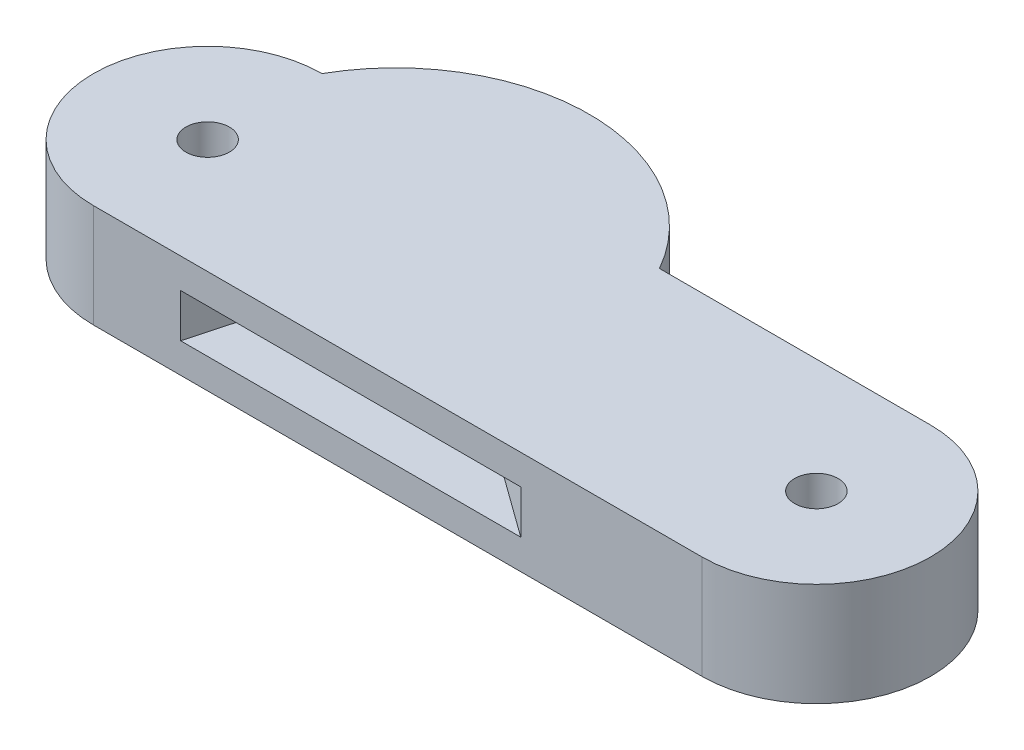
ISO-10303-21;
HEADER;
FILE_DESCRIPTION(('STEP AP214'),'2;1');
FILE_NAME('part.step','',(''),(''),'','','');
FILE_SCHEMA(('AUTOMOTIVE_DESIGN { 1 0 10303 214 1 1 1 1 }'));
ENDSEC;
DATA;
#1=APPLICATION_CONTEXT('core data for automotive mechanical design processes');
#2=APPLICATION_PROTOCOL_DEFINITION('international standard','automotive_design',2000,#1);
#3=PRODUCT_CONTEXT('',#1,'mechanical');
#4=PRODUCT('Part','Part','',(#3));
#5=PRODUCT_RELATED_PRODUCT_CATEGORY('part','',(#4));
#6=PRODUCT_DEFINITION_FORMATION('','',#4);
#7=PRODUCT_DEFINITION_CONTEXT('part definition',#1,'design');
#8=PRODUCT_DEFINITION('design','',#6,#7);
#9=PRODUCT_DEFINITION_SHAPE('','',#8);
#10=(LENGTH_UNIT() NAMED_UNIT(*) SI_UNIT(.MILLI.,.METRE.));
#11=(NAMED_UNIT(*) PLANE_ANGLE_UNIT() SI_UNIT($,.RADIAN.));
#12=(NAMED_UNIT(*) SI_UNIT($,.STERADIAN.) SOLID_ANGLE_UNIT());
#13=UNCERTAINTY_MEASURE_WITH_UNIT(LENGTH_MEASURE(1.E-05),#10,'distance_accuracy_value','');
#14=(GEOMETRIC_REPRESENTATION_CONTEXT(3) GLOBAL_UNCERTAINTY_ASSIGNED_CONTEXT((#13)) GLOBAL_UNIT_ASSIGNED_CONTEXT((#10,
#11,#12)) REPRESENTATION_CONTEXT('',''));
#15=CARTESIAN_POINT('',(0.,0.,0.));
#16=DIRECTION('',(0.,0.,1.));
#17=DIRECTION('',(1.,0.,0.));
#18=AXIS2_PLACEMENT_3D('',#15,#16,#17);
#19=CARTESIAN_POINT('',(0.,-4.75,0.));
#20=DIRECTION('',(0.,1.,0.));
#21=DIRECTION('',(0.,0.,-1.));
#22=AXIS2_PLACEMENT_3D('',#19,#20,#21);
#23=CYLINDRICAL_SURFACE('',#22,2.);
#24=CARTESIAN_POINT('',(0.,4.75,0.));
#25=DIRECTION('',(0.,1.,0.));
#26=DIRECTION('',(0.,0.,1.));
#27=AXIS2_PLACEMENT_3D('',#24,#25,#26);
#28=CIRCLE('',#27,2.);
#29=CARTESIAN_POINT('',(0.,4.75,2.));
#30=VERTEX_POINT('',#29);
#31=EDGE_CURVE('E219',#30,#30,#28,.T.);
#32=ORIENTED_EDGE('',*,*,#31,.T.);
#33=EDGE_LOOP('',(#32));
#34=FACE_BOUND('',#33,.T.);
#35=CARTESIAN_POINT('',(0.,-2.75,0.));
#36=DIRECTION('',(0.,1.,0.));
#37=DIRECTION('',(0.,0.,1.));
#38=AXIS2_PLACEMENT_3D('',#35,#36,#37);
#39=CIRCLE('',#38,2.);
#40=CARTESIAN_POINT('',(0.,-2.75,2.));
#41=VERTEX_POINT('',#40);
#42=EDGE_CURVE('E59',#41,#41,#39,.T.);
#43=ORIENTED_EDGE('',*,*,#42,.F.);
#44=EDGE_LOOP('',(#43));
#45=FACE_BOUND('',#44,.T.);
#46=ADVANCED_FACE('F55',(#34,#45),#23,.F.);
#47=CARTESIAN_POINT('',(-40.4241193156667,-37.0570550282,-1.7460511013579));
#48=DIRECTION('',(0.,1.,0.));
#49=DIRECTION('',(0.,0.,-1.));
#50=AXIS2_PLACEMENT_3D('',#47,#48,#49);
#51=CYLINDRICAL_SURFACE('',#50,17.8069548217708);
#52=CARTESIAN_POINT('',(-40.4241193156667,-4.75,-1.7460511013579));
#53=DIRECTION('',(0.,1.,0.));
#54=DIRECTION('',(0.,0.,1.));
#55=AXIS2_PLACEMENT_3D('',#52,#53,#54);
#56=CIRCLE('',#55,17.8069548217708);
#57=CARTESIAN_POINT('',(-24.917700351162,-4.75,-10.5003992165423));
#58=VERTEX_POINT('',#57);
#59=CARTESIAN_POINT('',(-55.9305382801715,-4.75,-10.5003992165423));
#60=VERTEX_POINT('',#59);
#61=EDGE_CURVE('E185',#58,#60,#56,.T.);
#62=ORIENTED_EDGE('',*,*,#61,.T.);
#63=DIRECTION('',(0.,1.,0.));
#64=VECTOR('',#63,1.);
#65=CARTESIAN_POINT('',(-55.9305382801715,-4.75,-10.5003992165423));
#66=LINE('',#65,#64);
#67=CARTESIAN_POINT('',(-55.9305382801715,4.75,-10.5003992165423));
#68=VERTEX_POINT('',#67);
#69=EDGE_CURVE('E260',#60,#68,#66,.T.);
#70=ORIENTED_EDGE('',*,*,#69,.T.);
#71=CARTESIAN_POINT('',(-40.4241193156667,4.75,-1.7460511013579));
#72=DIRECTION('',(0.,1.,0.));
#73=DIRECTION('',(0.,0.,1.));
#74=AXIS2_PLACEMENT_3D('',#71,#72,#73);
#75=CIRCLE('',#74,17.8069548217708);
#76=CARTESIAN_POINT('',(-24.917700351162,4.75,-10.5003992165423));
#77=VERTEX_POINT('',#76);
#78=EDGE_CURVE('E179',#68,#77,#75,.F.);
#79=ORIENTED_EDGE('',*,*,#78,.T.);
#80=DIRECTION('',(0.,1.,0.));
#81=VECTOR('',#80,1.);
#82=CARTESIAN_POINT('',(-24.917700351162,-37.0570550282,-10.5003992165423));
#83=LINE('',#82,#81);
#84=EDGE_CURVE('E184',#58,#77,#83,.T.);
#85=ORIENTED_EDGE('',*,*,#84,.F.);
#86=EDGE_LOOP('',(#62,#70,#79,#85));
#87=FACE_BOUND('',#86,.T.);
#88=CARTESIAN_POINT('',(-40.4241193156667,2.,-1.7460511013579));
#89=DIRECTION('',(0.,1.,0.));
#90=DIRECTION('',(0.,0.,1.));
#91=AXIS2_PLACEMENT_3D('',#88,#89,#90);
#92=CIRCLE('',#91,17.8069548217708);
#93=CARTESIAN_POINT('',(-35.7381547906292,2.,-18.9253810211969));
#94=VERTEX_POINT('',#93);
#95=CARTESIAN_POINT('',(-54.8543825263999,2.,-12.1794179449777));
#96=VERTEX_POINT('',#95);
#97=EDGE_CURVE('E161',#94,#96,#92,.T.);
#98=ORIENTED_EDGE('',*,*,#97,.T.);
#99=DIRECTION('',(0.,-1.,0.));
#100=VECTOR('',#99,1.);
#101=CARTESIAN_POINT('',(-54.8543825263999,2.,-12.1794179449777));
#102=LINE('',#101,#100);
#103=CARTESIAN_POINT('',(-54.8543825263999,-2.,-12.1794179449777));
#104=VERTEX_POINT('',#103);
#105=EDGE_CURVE('E164',#96,#104,#102,.T.);
#106=ORIENTED_EDGE('',*,*,#105,.T.);
#107=CARTESIAN_POINT('',(-40.4241193156667,-2.,-1.7460511013579));
#108=DIRECTION('',(0.,1.,0.));
#109=DIRECTION('',(0.,0.,1.));
#110=AXIS2_PLACEMENT_3D('',#107,#108,#109);
#111=CIRCLE('',#110,17.8069548217708);
#112=CARTESIAN_POINT('',(-35.7381547906292,-2.,-18.9253810211969));
#113=VERTEX_POINT('',#112);
#114=EDGE_CURVE('E162',#113,#104,#111,.T.);
#115=ORIENTED_EDGE('',*,*,#114,.F.);
#116=DIRECTION('',(0.,-1.,0.));
#117=VECTOR('',#116,1.);
#118=CARTESIAN_POINT('',(-35.7381547906292,2.,-18.9253810211969));
#119=LINE('',#118,#117);
#120=EDGE_CURVE('E148',#94,#113,#119,.T.);
#121=ORIENTED_EDGE('',*,*,#120,.F.);
#122=EDGE_LOOP('',(#98,#106,#115,#121));
#123=FACE_BOUND('',#122,.T.);
#124=ADVANCED_FACE('F159',(#87,#123),#51,.T.);
#125=CARTESIAN_POINT('',(0.,-4.75,-10.5003992165423));
#126=DIRECTION('',(0.,0.,1.));
#127=DIRECTION('',(1.,0.,0.));
#128=AXIS2_PLACEMENT_3D('',#125,#126,#127);
#129=PLANE('',#128);
#130=ORIENTED_EDGE('',*,*,#84,.T.);
#131=DIRECTION('',(-1.,0.,0.));
#132=VECTOR('',#131,1.);
#133=CARTESIAN_POINT('',(0.,4.75,-10.5003992165423));
#134=LINE('',#133,#132);
#135=CARTESIAN_POINT('',(0.,4.75,-10.5003992165423));
#136=VERTEX_POINT('',#135);
#137=EDGE_CURVE('E244',#136,#77,#134,.T.);
#138=ORIENTED_EDGE('',*,*,#137,.F.);
#139=DIRECTION('',(0.,1.,0.));
#140=VECTOR('',#139,1.);
#141=CARTESIAN_POINT('',(0.,-4.75,-10.5003992165423));
#142=LINE('',#141,#140);
#143=CARTESIAN_POINT('',(0.,-4.75,-10.5003992165423));
#144=VERTEX_POINT('',#143);
#145=EDGE_CURVE('E263',#144,#136,#142,.T.);
#146=ORIENTED_EDGE('',*,*,#145,.F.);
#147=DIRECTION('',(-1.,0.,0.));
#148=VECTOR('',#147,1.);
#149=CARTESIAN_POINT('',(0.,-4.75,-10.5003992165423));
#150=LINE('',#149,#148);
#151=EDGE_CURVE('E230',#144,#58,#150,.T.);
#152=ORIENTED_EDGE('',*,*,#151,.T.);
#153=EDGE_LOOP('',(#130,#138,#146,#152));
#154=FACE_BOUND('',#153,.T.);
#155=ADVANCED_FACE('F306',(#154),#129,.F.);
#156=CARTESIAN_POINT('',(0.,-4.75,10.5003992165423));
#157=DIRECTION('',(0.,0.,-1.));
#158=DIRECTION('',(-1.,0.,0.));
#159=AXIS2_PLACEMENT_3D('',#156,#157,#158);
#160=PLANE('',#159);
#161=DIRECTION('',(1.,0.,0.));
#162=VECTOR('',#161,1.);
#163=CARTESIAN_POINT('',(0.,4.75,10.5003992165423));
#164=LINE('',#163,#162);
#165=CARTESIAN_POINT('',(-55.9305382801715,4.75,10.5003992165423));
#166=VERTEX_POINT('',#165);
#167=CARTESIAN_POINT('',(0.,4.75,10.5003992165423));
#168=VERTEX_POINT('',#167);
#169=EDGE_CURVE('E231',#166,#168,#164,.T.);
#170=ORIENTED_EDGE('',*,*,#169,.F.);
#171=DIRECTION('',(0.,1.,0.));
#172=VECTOR('',#171,1.);
#173=CARTESIAN_POINT('',(-55.9305382801715,-4.75,10.5003992165423));
#174=LINE('',#173,#172);
#175=CARTESIAN_POINT('',(-55.9305382801715,-4.75,10.5003992165423));
#176=VERTEX_POINT('',#175);
#177=EDGE_CURVE('E256',#176,#166,#174,.T.);
#178=ORIENTED_EDGE('',*,*,#177,.F.);
#179=DIRECTION('',(1.,0.,0.));
#180=VECTOR('',#179,1.);
#181=CARTESIAN_POINT('',(0.,-4.75,10.5003992165423));
#182=LINE('',#181,#180);
#183=CARTESIAN_POINT('',(0.,-4.75,10.5003992165423));
#184=VERTEX_POINT('',#183);
#185=EDGE_CURVE('E237',#176,#184,#182,.T.);
#186=ORIENTED_EDGE('',*,*,#185,.T.);
#187=DIRECTION('',(0.,1.,0.));
#188=VECTOR('',#187,1.);
#189=CARTESIAN_POINT('',(0.,-4.75,10.5003992165423));
#190=LINE('',#189,#188);
#191=EDGE_CURVE('E241',#184,#168,#190,.T.);
#192=ORIENTED_EDGE('',*,*,#191,.T.);
#193=EDGE_LOOP('',(#170,#178,#186,#192));
#194=FACE_BOUND('',#193,.T.);
#195=DIRECTION('',(1.,0.,0.));
#196=VECTOR('',#195,1.);
#197=CARTESIAN_POINT('',(0.,2.,10.5003992165423));
#198=LINE('',#197,#196);
#199=CARTESIAN_POINT('',(-47.9106890267398,2.,10.5003992165423));
#200=VERTEX_POINT('',#199);
#201=CARTESIAN_POINT('',(-16.659276720951,2.,10.5003992165423));
#202=VERTEX_POINT('',#201);
#203=EDGE_CURVE('E13',#200,#202,#198,.T.);
#204=ORIENTED_EDGE('',*,*,#203,.T.);
#205=DIRECTION('',(0.,1.,0.));
#206=VECTOR('',#205,1.);
#207=CARTESIAN_POINT('',(-16.659276720951,-4.75,10.5003992165423));
#208=LINE('',#207,#206);
#209=CARTESIAN_POINT('',(-16.659276720951,-2.,10.5003992165423));
#210=VERTEX_POINT('',#209);
#211=EDGE_CURVE('E65',#210,#202,#208,.T.);
#212=ORIENTED_EDGE('',*,*,#211,.F.);
#213=DIRECTION('',(1.,0.,0.));
#214=VECTOR('',#213,1.);
#215=CARTESIAN_POINT('',(0.,-2.,10.5003992165423));
#216=LINE('',#215,#214);
#217=CARTESIAN_POINT('',(-47.9106890267398,-2.,10.5003992165423));
#218=VERTEX_POINT('',#217);
#219=EDGE_CURVE('E267',#218,#210,#216,.T.);
#220=ORIENTED_EDGE('',*,*,#219,.F.);
#221=DIRECTION('',(0.,-1.,0.));
#222=VECTOR('',#221,1.);
#223=CARTESIAN_POINT('',(-47.9106890267398,-4.75,10.5003992165423));
#224=LINE('',#223,#222);
#225=EDGE_CURVE('E270',#200,#218,#224,.T.);
#226=ORIENTED_EDGE('',*,*,#225,.F.);
#227=EDGE_LOOP('',(#204,#212,#220,#226));
#228=FACE_BOUND('',#227,.T.);
#229=ADVANCED_FACE('F283',(#194,#228),#160,.F.);
#230=CARTESIAN_POINT('',(0.,-4.75,0.));
#231=DIRECTION('',(0.,-1.,0.));
#232=DIRECTION('',(0.,0.,1.));
#233=AXIS2_PLACEMENT_3D('',#230,#231,#232);
#234=PLANE('',#233);
#235=CARTESIAN_POINT('',(0.,-4.75,0.));
#236=DIRECTION('',(0.,1.,0.));
#237=DIRECTION('',(0.,0.,1.));
#238=AXIS2_PLACEMENT_3D('',#235,#236,#237);
#239=CIRCLE('',#238,8.);
#240=CARTESIAN_POINT('',(0.,-4.75,8.));
#241=VERTEX_POINT('',#240);
#242=EDGE_CURVE('E175',#241,#241,#239,.T.);
#243=ORIENTED_EDGE('',*,*,#242,.T.);
#244=EDGE_LOOP('',(#243));
#245=FACE_BOUND('',#244,.T.);
#246=CARTESIAN_POINT('',(0.,-4.75,0.));
#247=DIRECTION('',(0.,1.,0.));
#248=DIRECTION('',(0.,0.,1.));
#249=AXIS2_PLACEMENT_3D('',#246,#247,#248);
#250=CIRCLE('',#249,10.5003992165423);
#251=EDGE_CURVE('E227',#184,#144,#250,.T.);
#252=ORIENTED_EDGE('',*,*,#251,.F.);
#253=ORIENTED_EDGE('',*,*,#185,.F.);
#254=CARTESIAN_POINT('',(-55.9305382801715,-4.75,0.));
#255=DIRECTION('',(0.,1.,0.));
#256=DIRECTION('',(0.,0.,1.));
#257=AXIS2_PLACEMENT_3D('',#254,#255,#256);
#258=CIRCLE('',#257,10.5003992165423);
#259=EDGE_CURVE('E234',#60,#176,#258,.T.);
#260=ORIENTED_EDGE('',*,*,#259,.F.);
#261=ORIENTED_EDGE('',*,*,#61,.F.);
#262=ORIENTED_EDGE('',*,*,#151,.F.);
#263=EDGE_LOOP('',(#252,#253,#260,#261,#262));
#264=FACE_BOUND('',#263,.T.);
#265=CARTESIAN_POINT('',(-55.9305382801715,-4.75,0.));
#266=DIRECTION('',(0.,1.,0.));
#267=DIRECTION('',(0.,0.,1.));
#268=AXIS2_PLACEMENT_3D('',#265,#266,#267);
#269=CIRCLE('',#268,2.);
#270=CARTESIAN_POINT('',(-55.9305382801715,-4.75,2.));
#271=VERTEX_POINT('',#270);
#272=EDGE_CURVE('E215',#271,#271,#269,.T.);
#273=ORIENTED_EDGE('',*,*,#272,.T.);
#274=EDGE_LOOP('',(#273));
#275=FACE_BOUND('',#274,.T.);
#276=ADVANCED_FACE('F312',(#245,#264,#275),#234,.T.);
#277=CARTESIAN_POINT('',(0.,4.75,0.));
#278=DIRECTION('',(0.,-1.,0.));
#279=DIRECTION('',(0.,0.,1.));
#280=AXIS2_PLACEMENT_3D('',#277,#278,#279);
#281=PLANE('',#280);
#282=CARTESIAN_POINT('',(0.,4.75,0.));
#283=DIRECTION('',(0.,1.,0.));
#284=DIRECTION('',(0.,0.,1.));
#285=AXIS2_PLACEMENT_3D('',#282,#283,#284);
#286=CIRCLE('',#285,10.5003992165423);
#287=EDGE_CURVE('E226',#168,#136,#286,.T.);
#288=ORIENTED_EDGE('',*,*,#287,.T.);
#289=ORIENTED_EDGE('',*,*,#137,.T.);
#290=ORIENTED_EDGE('',*,*,#78,.F.);
#291=CARTESIAN_POINT('',(-55.9305382801715,4.75,0.));
#292=DIRECTION('',(0.,1.,0.));
#293=DIRECTION('',(0.,0.,1.));
#294=AXIS2_PLACEMENT_3D('',#291,#292,#293);
#295=CIRCLE('',#294,10.5003992165423);
#296=EDGE_CURVE('E247',#68,#166,#295,.T.);
#297=ORIENTED_EDGE('',*,*,#296,.T.);
#298=ORIENTED_EDGE('',*,*,#169,.T.);
#299=EDGE_LOOP('',(#288,#289,#290,#297,#298));
#300=FACE_BOUND('',#299,.T.);
#301=ORIENTED_EDGE('',*,*,#31,.F.);
#302=EDGE_LOOP('',(#301));
#303=FACE_BOUND('',#302,.T.);
#304=CARTESIAN_POINT('',(-55.9305382801715,4.75,0.));
#305=DIRECTION('',(0.,1.,0.));
#306=DIRECTION('',(0.,0.,1.));
#307=AXIS2_PLACEMENT_3D('',#304,#305,#306);
#308=CIRCLE('',#307,2.);
#309=CARTESIAN_POINT('',(-55.9305382801715,4.75,2.));
#310=VERTEX_POINT('',#309);
#311=EDGE_CURVE('E212',#310,#310,#308,.T.);
#312=ORIENTED_EDGE('',*,*,#311,.F.);
#313=EDGE_LOOP('',(#312));
#314=FACE_BOUND('',#313,.T.);
#315=ADVANCED_FACE('F315',(#300,#303,#314),#281,.F.);
#316=CARTESIAN_POINT('',(0.,-4.75,0.));
#317=DIRECTION('',(0.,1.,0.));
#318=DIRECTION('',(0.,0.,-1.));
#319=AXIS2_PLACEMENT_3D('',#316,#317,#318);
#320=CYLINDRICAL_SURFACE('',#319,10.5003992165423);
#321=ORIENTED_EDGE('',*,*,#287,.F.);
#322=ORIENTED_EDGE('',*,*,#191,.F.);
#323=ORIENTED_EDGE('',*,*,#251,.T.);
#324=ORIENTED_EDGE('',*,*,#145,.T.);
#325=EDGE_LOOP('',(#321,#322,#323,#324));
#326=FACE_BOUND('',#325,.T.);
#327=ADVANCED_FACE('F57',(#326),#320,.T.);
#328=CARTESIAN_POINT('',(-55.9305382801715,-4.75,0.));
#329=DIRECTION('',(0.,1.,0.));
#330=DIRECTION('',(0.,0.,-1.));
#331=AXIS2_PLACEMENT_3D('',#328,#329,#330);
#332=CYLINDRICAL_SURFACE('',#331,10.5003992165423);
#333=ORIENTED_EDGE('',*,*,#296,.F.);
#334=ORIENTED_EDGE('',*,*,#69,.F.);
#335=ORIENTED_EDGE('',*,*,#259,.T.);
#336=ORIENTED_EDGE('',*,*,#177,.T.);
#337=EDGE_LOOP('',(#333,#334,#335,#336));
#338=FACE_BOUND('',#337,.T.);
#339=ADVANCED_FACE('F296',(#338),#332,.T.);
#340=CARTESIAN_POINT('',(-55.9305382801715,-4.75,0.));
#341=DIRECTION('',(0.,1.,0.));
#342=DIRECTION('',(0.,0.,-1.));
#343=AXIS2_PLACEMENT_3D('',#340,#341,#342);
#344=CYLINDRICAL_SURFACE('',#343,2.);
#345=ORIENTED_EDGE('',*,*,#272,.F.);
#346=EDGE_LOOP('',(#345));
#347=FACE_BOUND('',#346,.T.);
#348=ORIENTED_EDGE('',*,*,#311,.T.);
#349=EDGE_LOOP('',(#348));
#350=FACE_BOUND('',#349,.T.);
#351=ADVANCED_FACE('F289',(#347,#350),#344,.F.);
#352=CARTESIAN_POINT('',(-43.8872651072943,2.,-4.24997427651618));
#353=DIRECTION('',(-0.585915275691269,0.,0.810372315489383));
#354=DIRECTION('',(0.810372315489383,0.,0.585915275691269));
#355=AXIS2_PLACEMENT_3D('',#352,#353,#354);
#356=PLANE('',#355);
#357=DIRECTION('',(0.810372315489383,0.,0.585915275691269));
#358=VECTOR('',#357,1.);
#359=CARTESIAN_POINT('',(-43.8872651072943,-2.,-4.24997427651618));
#360=LINE('',#359,#358);
#361=CARTESIAN_POINT('',(-43.8872651072943,-2.,-4.24997427651618));
#362=VERTEX_POINT('',#361);
#363=EDGE_CURVE('E72',#104,#362,#360,.T.);
#364=ORIENTED_EDGE('',*,*,#363,.F.);
#365=ORIENTED_EDGE('',*,*,#105,.F.);
#366=DIRECTION('',(0.810372315489383,0.,0.585915275691269));
#367=VECTOR('',#366,1.);
#368=CARTESIAN_POINT('',(-43.8872651072943,2.,-4.24997427651618));
#369=LINE('',#368,#367);
#370=CARTESIAN_POINT('',(-43.8872651072943,2.,-4.24997427651618));
#371=VERTEX_POINT('',#370);
#372=EDGE_CURVE('E154',#96,#371,#369,.T.);
#373=ORIENTED_EDGE('',*,*,#372,.T.);
#374=DIRECTION('',(0.,-1.,0.));
#375=VECTOR('',#374,1.);
#376=CARTESIAN_POINT('',(-43.8872651072943,2.,-4.24997427651618));
#377=LINE('',#376,#375);
#378=EDGE_CURVE('E209',#371,#362,#377,.T.);
#379=ORIENTED_EDGE('',*,*,#378,.T.);
#380=EDGE_LOOP('',(#364,#365,#373,#379));
#381=FACE_BOUND('',#380,.T.);
#382=ADVANCED_FACE('F287',(#381),#356,.F.);
#383=CARTESIAN_POINT('',(-35.7518279113757,2.,-18.8752536565782));
#384=DIRECTION('',(0.964753945398658,0.,0.263153614525288));
#385=DIRECTION('',(0.263153614525288,0.,-0.964753945398658));
#386=AXIS2_PLACEMENT_3D('',#383,#384,#385);
#387=PLANE('',#386);
#388=DIRECTION('',(0.263153614525288,0.,-0.964753945398658));
#389=VECTOR('',#388,1.);
#390=CARTESIAN_POINT('',(-35.7518279113757,2.,-18.8752536565782));
#391=LINE('',#390,#389);
#392=CARTESIAN_POINT('',(-39.2995259463282,2.,-5.86895054165502));
#393=VERTEX_POINT('',#392);
#394=EDGE_CURVE('E144',#393,#94,#391,.T.);
#395=ORIENTED_EDGE('',*,*,#394,.T.);
#396=ORIENTED_EDGE('',*,*,#120,.T.);
#397=DIRECTION('',(0.263153614525288,0.,-0.964753945398658));
#398=VECTOR('',#397,1.);
#399=CARTESIAN_POINT('',(-35.7518279113757,-2.,-18.8752536565782));
#400=LINE('',#399,#398);
#401=CARTESIAN_POINT('',(-39.2995259463282,-2.,-5.86895054165502));
#402=VERTEX_POINT('',#401);
#403=EDGE_CURVE('E202',#402,#113,#400,.T.);
#404=ORIENTED_EDGE('',*,*,#403,.F.);
#405=DIRECTION('',(0.,-1.,0.));
#406=VECTOR('',#405,1.);
#407=CARTESIAN_POINT('',(-39.2995259463282,2.,-5.86895054165502));
#408=LINE('',#407,#406);
#409=EDGE_CURVE('E150',#393,#402,#408,.T.);
#410=ORIENTED_EDGE('',*,*,#409,.F.);
#411=EDGE_LOOP('',(#395,#396,#404,#410));
#412=FACE_BOUND('',#411,.T.);
#413=ADVANCED_FACE('F146',(#412),#387,.F.);
#414=CARTESIAN_POINT('',(26.6452391554762,2.,41.8104240945407));
#415=DIRECTION('',(0.585915275691269,0.,-0.810372315489383));
#416=DIRECTION('',(-0.810372315489383,0.,-0.585915275691269));
#417=AXIS2_PLACEMENT_3D('',#414,#415,#416);
#418=PLANE('',#417);
#419=DIRECTION('',(-0.810372315489383,0.,-0.585915275691269));
#420=VECTOR('',#419,1.);
#421=CARTESIAN_POINT('',(26.6452391554762,-2.,41.8104240945407));
#422=LINE('',#421,#420);
#423=EDGE_CURVE('E80',#210,#402,#422,.T.);
#424=ORIENTED_EDGE('',*,*,#423,.F.);
#425=ORIENTED_EDGE('',*,*,#211,.T.);
#426=DIRECTION('',(-0.810372315489383,0.,-0.585915275691269));
#427=VECTOR('',#426,1.);
#428=CARTESIAN_POINT('',(26.6452391554762,2.,41.8104240945407));
#429=LINE('',#428,#427);
#430=EDGE_CURVE('E155',#202,#393,#429,.T.);
#431=ORIENTED_EDGE('',*,*,#430,.T.);
#432=ORIENTED_EDGE('',*,*,#409,.T.);
#433=EDGE_LOOP('',(#424,#425,#431,#432));
#434=FACE_BOUND('',#433,.T.);
#435=ADVANCED_FACE('F278',(#434),#418,.F.);
#436=CARTESIAN_POINT('',(-43.8872651072943,2.,-4.24997427651618));
#437=DIRECTION('',(-0.964753945398657,0.,-0.263153614525289));
#438=DIRECTION('',(-0.263153614525289,0.,0.964753945398657));
#439=AXIS2_PLACEMENT_3D('',#436,#437,#438);
#440=PLANE('',#439);
#441=DIRECTION('',(-0.263153614525289,0.,0.964753945398657));
#442=VECTOR('',#441,1.);
#443=CARTESIAN_POINT('',(-43.8872651072943,2.,-4.24997427651618));
#444=LINE('',#443,#442);
#445=EDGE_CURVE('E197',#371,#200,#444,.T.);
#446=ORIENTED_EDGE('',*,*,#445,.T.);
#447=ORIENTED_EDGE('',*,*,#225,.T.);
#448=DIRECTION('',(-0.263153614525289,0.,0.964753945398657));
#449=VECTOR('',#448,1.);
#450=CARTESIAN_POINT('',(-43.8872651072943,-2.,-4.24997427651618));
#451=LINE('',#450,#449);
#452=EDGE_CURVE('E193',#362,#218,#451,.T.);
#453=ORIENTED_EDGE('',*,*,#452,.F.);
#454=ORIENTED_EDGE('',*,*,#378,.F.);
#455=EDGE_LOOP('',(#446,#447,#453,#454));
#456=FACE_BOUND('',#455,.T.);
#457=ADVANCED_FACE('F286',(#456),#440,.F.);
#458=CARTESIAN_POINT('',(-41.5933955268113,2.,-5.05946240908561));
#459=DIRECTION('',(0.,-1.,0.));
#460=DIRECTION('',(0.,0.,1.));
#461=AXIS2_PLACEMENT_3D('',#458,#459,#460);
#462=PLANE('',#461);
#463=ORIENTED_EDGE('',*,*,#394,.F.);
#464=ORIENTED_EDGE('',*,*,#430,.F.);
#465=ORIENTED_EDGE('',*,*,#203,.F.);
#466=ORIENTED_EDGE('',*,*,#445,.F.);
#467=ORIENTED_EDGE('',*,*,#372,.F.);
#468=ORIENTED_EDGE('',*,*,#97,.F.);
#469=EDGE_LOOP('',(#463,#464,#465,#466,#467,#468));
#470=FACE_BOUND('',#469,.T.);
#471=ADVANCED_FACE('F166',(#470),#462,.T.);
#472=CARTESIAN_POINT('',(-41.5933955268113,-2.,-5.05946240908561));
#473=DIRECTION('',(0.,-1.,0.));
#474=DIRECTION('',(0.,0.,1.));
#475=AXIS2_PLACEMENT_3D('',#472,#473,#474);
#476=PLANE('',#475);
#477=ORIENTED_EDGE('',*,*,#403,.T.);
#478=ORIENTED_EDGE('',*,*,#114,.T.);
#479=ORIENTED_EDGE('',*,*,#363,.T.);
#480=ORIENTED_EDGE('',*,*,#452,.T.);
#481=ORIENTED_EDGE('',*,*,#219,.T.);
#482=ORIENTED_EDGE('',*,*,#423,.T.);
#483=EDGE_LOOP('',(#477,#478,#479,#480,#481,#482));
#484=FACE_BOUND('',#483,.T.);
#485=ADVANCED_FACE('F400',(#484),#476,.F.);
#486=CARTESIAN_POINT('',(0.,-2.75,0.));
#487=DIRECTION('',(0.,-1.,0.));
#488=DIRECTION('',(0.,0.,1.));
#489=AXIS2_PLACEMENT_3D('',#486,#487,#488);
#490=CYLINDRICAL_SURFACE('',#489,8.);
#491=CARTESIAN_POINT('',(0.,-2.75,0.));
#492=DIRECTION('',(0.,1.,0.));
#493=DIRECTION('',(0.,0.,1.));
#494=AXIS2_PLACEMENT_3D('',#491,#492,#493);
#495=CIRCLE('',#494,8.);
#496=CARTESIAN_POINT('',(0.,-2.75,8.));
#497=VERTEX_POINT('',#496);
#498=EDGE_CURVE('E518',#497,#497,#495,.T.);
#499=ORIENTED_EDGE('',*,*,#498,.T.);
#500=EDGE_LOOP('',(#499));
#501=FACE_BOUND('',#500,.T.);
#502=ORIENTED_EDGE('',*,*,#242,.F.);
#503=EDGE_LOOP('',(#502));
#504=FACE_BOUND('',#503,.T.);
#505=ADVANCED_FACE('F410',(#501,#504),#490,.F.);
#506=CARTESIAN_POINT('',(0.,-2.75,0.));
#507=DIRECTION('',(0.,-1.,0.));
#508=DIRECTION('',(0.,0.,1.));
#509=AXIS2_PLACEMENT_3D('',#506,#507,#508);
#510=PLANE('',#509);
#511=ORIENTED_EDGE('',*,*,#42,.T.);
#512=EDGE_LOOP('',(#511));
#513=FACE_BOUND('',#512,.T.);
#514=ORIENTED_EDGE('',*,*,#498,.F.);
#515=EDGE_LOOP('',(#514));
#516=FACE_BOUND('',#515,.T.);
#517=ADVANCED_FACE('F420',(#513,#516),#510,.T.);
#518=CLOSED_SHELL('',(#46,#124,#155,#229,#276,#315,#327,#339,#351,#382,#413,#435,#457,#471,#485,
#505,#517));
#519=MANIFOLD_SOLID_BREP('B2',#518);
#520=ADVANCED_BREP_SHAPE_REPRESENTATION('',(#18,#519),#14);
#521=SHAPE_DEFINITION_REPRESENTATION(#9,#520);
ENDSEC;
END-ISO-10303-21;
